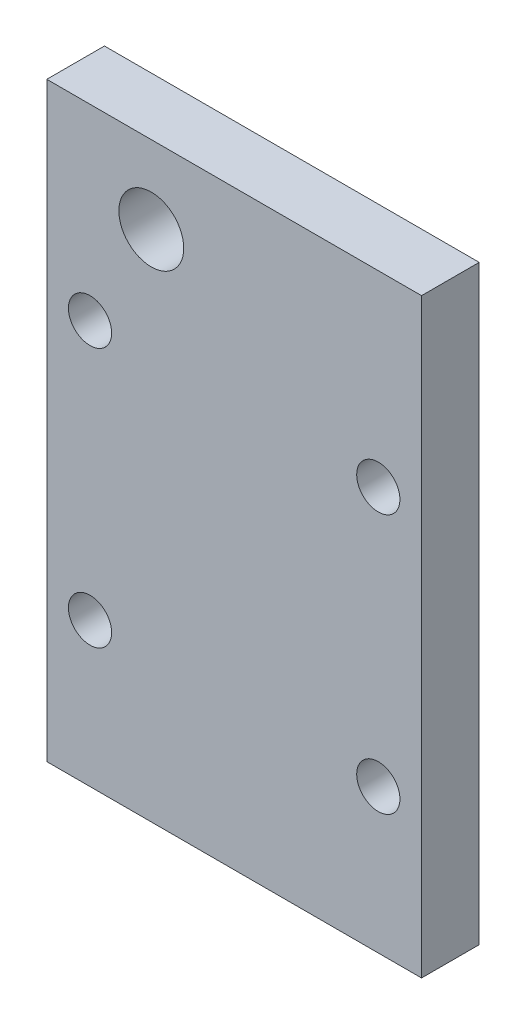
ISO-10303-21;
HEADER;
FILE_DESCRIPTION(('STEP AP214'),'2;1');
FILE_NAME('part.step','',(''),(''),'','','');
FILE_SCHEMA(('AUTOMOTIVE_DESIGN { 1 0 10303 214 1 1 1 1 }'));
ENDSEC;
DATA;
#1=APPLICATION_CONTEXT('core data for automotive mechanical design processes');
#2=APPLICATION_PROTOCOL_DEFINITION('international standard','automotive_design',2000,#1);
#3=PRODUCT_CONTEXT('',#1,'mechanical');
#4=PRODUCT('Part','Part','',(#3));
#5=PRODUCT_RELATED_PRODUCT_CATEGORY('part','',(#4));
#6=PRODUCT_DEFINITION_FORMATION('','',#4);
#7=PRODUCT_DEFINITION_CONTEXT('part definition',#1,'design');
#8=PRODUCT_DEFINITION('design','',#6,#7);
#9=PRODUCT_DEFINITION_SHAPE('','',#8);
#10=(LENGTH_UNIT() NAMED_UNIT(*) SI_UNIT(.MILLI.,.METRE.));
#11=(NAMED_UNIT(*) PLANE_ANGLE_UNIT() SI_UNIT($,.RADIAN.));
#12=(NAMED_UNIT(*) SI_UNIT($,.STERADIAN.) SOLID_ANGLE_UNIT());
#13=UNCERTAINTY_MEASURE_WITH_UNIT(LENGTH_MEASURE(1.E-05),#10,'distance_accuracy_value','');
#14=(GEOMETRIC_REPRESENTATION_CONTEXT(3) GLOBAL_UNCERTAINTY_ASSIGNED_CONTEXT((#13)) GLOBAL_UNIT_ASSIGNED_CONTEXT((#10,
#11,#12)) REPRESENTATION_CONTEXT('',''));
#15=CARTESIAN_POINT('',(0.,0.,0.));
#16=DIRECTION('',(0.,0.,1.));
#17=DIRECTION('',(1.,0.,0.));
#18=AXIS2_PLACEMENT_3D('',#15,#16,#17);
#19=CARTESIAN_POINT('',(0.,0.,4.));
#20=DIRECTION('',(0.,0.,-1.));
#21=DIRECTION('',(-1.,0.,0.));
#22=AXIS2_PLACEMENT_3D('',#19,#20,#21);
#23=PLANE('',#22);
#24=DIRECTION('',(1.,0.,0.));
#25=VECTOR('',#24,1.);
#26=CARTESIAN_POINT('',(26.,0.,4.));
#27=LINE('',#26,#25);
#28=CARTESIAN_POINT('',(0.,0.,4.));
#29=VERTEX_POINT('',#28);
#30=CARTESIAN_POINT('',(26.,0.,4.));
#31=VERTEX_POINT('',#30);
#32=EDGE_CURVE('E89',#29,#31,#27,.T.);
#33=ORIENTED_EDGE('',*,*,#32,.T.);
#34=DIRECTION('',(0.,1.,0.));
#35=VECTOR('',#34,1.);
#36=CARTESIAN_POINT('',(26.,41.,4.));
#37=LINE('',#36,#35);
#38=CARTESIAN_POINT('',(26.,41.,4.));
#39=VERTEX_POINT('',#38);
#40=EDGE_CURVE('E84',#31,#39,#37,.T.);
#41=ORIENTED_EDGE('',*,*,#40,.T.);
#42=DIRECTION('',(-1.,0.,0.));
#43=VECTOR('',#42,1.);
#44=CARTESIAN_POINT('',(0.,41.,4.));
#45=LINE('',#44,#43);
#46=CARTESIAN_POINT('',(0.,41.,4.));
#47=VERTEX_POINT('',#46);
#48=EDGE_CURVE('E87',#39,#47,#45,.T.);
#49=ORIENTED_EDGE('',*,*,#48,.T.);
#50=DIRECTION('',(0.,-1.,0.));
#51=VECTOR('',#50,1.);
#52=CARTESIAN_POINT('',(0.,0.,4.));
#53=LINE('',#52,#51);
#54=EDGE_CURVE('E54',#47,#29,#53,.T.);
#55=ORIENTED_EDGE('',*,*,#54,.T.);
#56=EDGE_LOOP('',(#33,#41,#49,#55));
#57=FACE_BOUND('',#56,.T.);
#58=CARTESIAN_POINT('',(7.24999999999999,35.6,4.));
#59=DIRECTION('',(0.,0.,1.));
#60=DIRECTION('',(1.,0.,0.));
#61=AXIS2_PLACEMENT_3D('',#58,#59,#60);
#62=CIRCLE('',#61,2.25);
#63=CARTESIAN_POINT('',(9.49999999999999,35.6,4.));
#64=VERTEX_POINT('',#63);
#65=EDGE_CURVE('E104',#64,#64,#62,.T.);
#66=ORIENTED_EDGE('',*,*,#65,.F.);
#67=EDGE_LOOP('',(#66));
#68=FACE_BOUND('',#67,.T.);
#69=CARTESIAN_POINT('',(3.00000000000001,28.,4.));
#70=DIRECTION('',(0.,0.,1.));
#71=DIRECTION('',(1.,0.,0.));
#72=AXIS2_PLACEMENT_3D('',#69,#70,#71);
#73=CIRCLE('',#72,1.5);
#74=CARTESIAN_POINT('',(4.50000000000001,28.,4.));
#75=VERTEX_POINT('',#74);
#76=EDGE_CURVE('E119',#75,#75,#73,.T.);
#77=ORIENTED_EDGE('',*,*,#76,.F.);
#78=EDGE_LOOP('',(#77));
#79=FACE_BOUND('',#78,.T.);
#80=CARTESIAN_POINT('',(3.00000000000001,10.,4.));
#81=DIRECTION('',(0.,0.,1.));
#82=DIRECTION('',(1.,0.,0.));
#83=AXIS2_PLACEMENT_3D('',#80,#81,#82);
#84=CIRCLE('',#83,1.5);
#85=CARTESIAN_POINT('',(4.50000000000001,10.,4.));
#86=VERTEX_POINT('',#85);
#87=EDGE_CURVE('E125',#86,#86,#84,.T.);
#88=ORIENTED_EDGE('',*,*,#87,.F.);
#89=EDGE_LOOP('',(#88));
#90=FACE_BOUND('',#89,.T.);
#91=CARTESIAN_POINT('',(23.,10.,4.));
#92=DIRECTION('',(0.,0.,1.));
#93=DIRECTION('',(-1.,0.,0.));
#94=AXIS2_PLACEMENT_3D('',#91,#92,#93);
#95=CIRCLE('',#94,1.5);
#96=CARTESIAN_POINT('',(21.5,10.,4.));
#97=VERTEX_POINT('',#96);
#98=EDGE_CURVE('E131',#97,#97,#95,.T.);
#99=ORIENTED_EDGE('',*,*,#98,.F.);
#100=EDGE_LOOP('',(#99));
#101=FACE_BOUND('',#100,.T.);
#102=CARTESIAN_POINT('',(23.,28.,4.));
#103=DIRECTION('',(0.,0.,1.));
#104=DIRECTION('',(-1.,0.,0.));
#105=AXIS2_PLACEMENT_3D('',#102,#103,#104);
#106=CIRCLE('',#105,1.5);
#107=CARTESIAN_POINT('',(21.5,28.,4.));
#108=VERTEX_POINT('',#107);
#109=EDGE_CURVE('E137',#108,#108,#106,.T.);
#110=ORIENTED_EDGE('',*,*,#109,.F.);
#111=EDGE_LOOP('',(#110));
#112=FACE_BOUND('',#111,.T.);
#113=ADVANCED_FACE('F37',(#57,#68,#79,#90,#101,#112),#23,.F.);
#114=CARTESIAN_POINT('',(0.,0.,0.));
#115=DIRECTION('',(0.,0.,-1.));
#116=DIRECTION('',(-1.,0.,0.));
#117=AXIS2_PLACEMENT_3D('',#114,#115,#116);
#118=PLANE('',#117);
#119=CARTESIAN_POINT('',(23.,10.,0.));
#120=DIRECTION('',(0.,0.,1.));
#121=DIRECTION('',(-1.,0.,0.));
#122=AXIS2_PLACEMENT_3D('',#119,#120,#121);
#123=CIRCLE('',#122,1.5);
#124=CARTESIAN_POINT('',(21.5,10.,0.));
#125=VERTEX_POINT('',#124);
#126=EDGE_CURVE('E134',#125,#125,#123,.T.);
#127=ORIENTED_EDGE('',*,*,#126,.T.);
#128=EDGE_LOOP('',(#127));
#129=FACE_BOUND('',#128,.T.);
#130=CARTESIAN_POINT('',(3.00000000000001,28.,0.));
#131=DIRECTION('',(0.,0.,1.));
#132=DIRECTION('',(1.,0.,0.));
#133=AXIS2_PLACEMENT_3D('',#130,#131,#132);
#134=CIRCLE('',#133,1.5);
#135=CARTESIAN_POINT('',(4.50000000000001,28.,0.));
#136=VERTEX_POINT('',#135);
#137=EDGE_CURVE('E122',#136,#136,#134,.T.);
#138=ORIENTED_EDGE('',*,*,#137,.T.);
#139=EDGE_LOOP('',(#138));
#140=FACE_BOUND('',#139,.T.);
#141=DIRECTION('',(1.,0.,0.));
#142=VECTOR('',#141,1.);
#143=CARTESIAN_POINT('',(26.,0.,0.));
#144=LINE('',#143,#142);
#145=CARTESIAN_POINT('',(0.,0.,0.));
#146=VERTEX_POINT('',#145);
#147=CARTESIAN_POINT('',(26.,0.,0.));
#148=VERTEX_POINT('',#147);
#149=EDGE_CURVE('E101',#146,#148,#144,.T.);
#150=ORIENTED_EDGE('',*,*,#149,.F.);
#151=DIRECTION('',(0.,-1.,0.));
#152=VECTOR('',#151,1.);
#153=CARTESIAN_POINT('',(0.,0.,0.));
#154=LINE('',#153,#152);
#155=CARTESIAN_POINT('',(0.,41.,0.));
#156=VERTEX_POINT('',#155);
#157=EDGE_CURVE('E77',#156,#146,#154,.T.);
#158=ORIENTED_EDGE('',*,*,#157,.F.);
#159=DIRECTION('',(-1.,0.,0.));
#160=VECTOR('',#159,1.);
#161=CARTESIAN_POINT('',(0.,41.,0.));
#162=LINE('',#161,#160);
#163=CARTESIAN_POINT('',(26.,41.,0.));
#164=VERTEX_POINT('',#163);
#165=EDGE_CURVE('E71',#164,#156,#162,.T.);
#166=ORIENTED_EDGE('',*,*,#165,.F.);
#167=DIRECTION('',(0.,1.,0.));
#168=VECTOR('',#167,1.);
#169=CARTESIAN_POINT('',(26.,41.,0.));
#170=LINE('',#169,#168);
#171=EDGE_CURVE('E93',#148,#164,#170,.T.);
#172=ORIENTED_EDGE('',*,*,#171,.F.);
#173=EDGE_LOOP('',(#150,#158,#166,#172));
#174=FACE_BOUND('',#173,.T.);
#175=CARTESIAN_POINT('',(7.24999999999999,35.6,0.));
#176=DIRECTION('',(0.,0.,1.));
#177=DIRECTION('',(1.,0.,0.));
#178=AXIS2_PLACEMENT_3D('',#175,#176,#177);
#179=CIRCLE('',#178,2.25);
#180=CARTESIAN_POINT('',(9.49999999999999,35.6,0.));
#181=VERTEX_POINT('',#180);
#182=EDGE_CURVE('E116',#181,#181,#179,.T.);
#183=ORIENTED_EDGE('',*,*,#182,.T.);
#184=EDGE_LOOP('',(#183));
#185=FACE_BOUND('',#184,.T.);
#186=CARTESIAN_POINT('',(3.00000000000001,10.,0.));
#187=DIRECTION('',(0.,0.,1.));
#188=DIRECTION('',(1.,0.,0.));
#189=AXIS2_PLACEMENT_3D('',#186,#187,#188);
#190=CIRCLE('',#189,1.5);
#191=CARTESIAN_POINT('',(4.50000000000001,10.,0.));
#192=VERTEX_POINT('',#191);
#193=EDGE_CURVE('E128',#192,#192,#190,.T.);
#194=ORIENTED_EDGE('',*,*,#193,.T.);
#195=EDGE_LOOP('',(#194));
#196=FACE_BOUND('',#195,.T.);
#197=CARTESIAN_POINT('',(23.,28.,0.));
#198=DIRECTION('',(0.,0.,1.));
#199=DIRECTION('',(-1.,0.,0.));
#200=AXIS2_PLACEMENT_3D('',#197,#198,#199);
#201=CIRCLE('',#200,1.5);
#202=CARTESIAN_POINT('',(21.5,28.,0.));
#203=VERTEX_POINT('',#202);
#204=EDGE_CURVE('E140',#203,#203,#201,.T.);
#205=ORIENTED_EDGE('',*,*,#204,.T.);
#206=EDGE_LOOP('',(#205));
#207=FACE_BOUND('',#206,.T.);
#208=ADVANCED_FACE('F112',(#129,#140,#174,#185,#196,#207),#118,.T.);
#209=CARTESIAN_POINT('',(26.,0.,4.));
#210=DIRECTION('',(0.,1.,0.));
#211=DIRECTION('',(-1.,0.,0.));
#212=AXIS2_PLACEMENT_3D('',#209,#210,#211);
#213=PLANE('',#212);
#214=ORIENTED_EDGE('',*,*,#149,.T.);
#215=DIRECTION('',(0.,0.,-1.));
#216=VECTOR('',#215,1.);
#217=CARTESIAN_POINT('',(26.,0.,4.));
#218=LINE('',#217,#216);
#219=EDGE_CURVE('E11',#31,#148,#218,.T.);
#220=ORIENTED_EDGE('',*,*,#219,.F.);
#221=ORIENTED_EDGE('',*,*,#32,.F.);
#222=DIRECTION('',(0.,0.,-1.));
#223=VECTOR('',#222,1.);
#224=CARTESIAN_POINT('',(0.,0.,4.));
#225=LINE('',#224,#223);
#226=EDGE_CURVE('E97',#29,#146,#225,.T.);
#227=ORIENTED_EDGE('',*,*,#226,.T.);
#228=EDGE_LOOP('',(#214,#220,#221,#227));
#229=FACE_BOUND('',#228,.T.);
#230=ADVANCED_FACE('F39',(#229),#213,.F.);
#231=CARTESIAN_POINT('',(26.,41.,4.));
#232=DIRECTION('',(-1.,0.,0.));
#233=DIRECTION('',(0.,-1.,0.));
#234=AXIS2_PLACEMENT_3D('',#231,#232,#233);
#235=PLANE('',#234);
#236=ORIENTED_EDGE('',*,*,#171,.T.);
#237=DIRECTION('',(0.,0.,-1.));
#238=VECTOR('',#237,1.);
#239=CARTESIAN_POINT('',(26.,41.,4.));
#240=LINE('',#239,#238);
#241=EDGE_CURVE('E46',#39,#164,#240,.T.);
#242=ORIENTED_EDGE('',*,*,#241,.F.);
#243=ORIENTED_EDGE('',*,*,#40,.F.);
#244=ORIENTED_EDGE('',*,*,#219,.T.);
#245=EDGE_LOOP('',(#236,#242,#243,#244));
#246=FACE_BOUND('',#245,.T.);
#247=ADVANCED_FACE('F92',(#246),#235,.F.);
#248=CARTESIAN_POINT('',(0.,41.,4.));
#249=DIRECTION('',(0.,-1.,0.));
#250=DIRECTION('',(0.,0.,-1.));
#251=AXIS2_PLACEMENT_3D('',#248,#249,#250);
#252=PLANE('',#251);
#253=ORIENTED_EDGE('',*,*,#165,.T.);
#254=DIRECTION('',(0.,0.,-1.));
#255=VECTOR('',#254,1.);
#256=CARTESIAN_POINT('',(0.,41.,4.));
#257=LINE('',#256,#255);
#258=EDGE_CURVE('E94',#47,#156,#257,.T.);
#259=ORIENTED_EDGE('',*,*,#258,.F.);
#260=ORIENTED_EDGE('',*,*,#48,.F.);
#261=ORIENTED_EDGE('',*,*,#241,.T.);
#262=EDGE_LOOP('',(#253,#259,#260,#261));
#263=FACE_BOUND('',#262,.T.);
#264=ADVANCED_FACE('F95',(#263),#252,.F.);
#265=CARTESIAN_POINT('',(0.,0.,4.));
#266=DIRECTION('',(1.,0.,0.));
#267=DIRECTION('',(0.,0.,-1.));
#268=AXIS2_PLACEMENT_3D('',#265,#266,#267);
#269=PLANE('',#268);
#270=ORIENTED_EDGE('',*,*,#157,.T.);
#271=ORIENTED_EDGE('',*,*,#226,.F.);
#272=ORIENTED_EDGE('',*,*,#54,.F.);
#273=ORIENTED_EDGE('',*,*,#258,.T.);
#274=EDGE_LOOP('',(#270,#271,#272,#273));
#275=FACE_BOUND('',#274,.T.);
#276=ADVANCED_FACE('F109',(#275),#269,.F.);
#277=CARTESIAN_POINT('',(7.24999999999999,35.6,4.));
#278=DIRECTION('',(0.,0.,-1.));
#279=DIRECTION('',(-1.,0.,0.));
#280=AXIS2_PLACEMENT_3D('',#277,#278,#279);
#281=CYLINDRICAL_SURFACE('',#280,2.25);
#282=ORIENTED_EDGE('',*,*,#65,.T.);
#283=EDGE_LOOP('',(#282));
#284=FACE_BOUND('',#283,.T.);
#285=ORIENTED_EDGE('',*,*,#182,.F.);
#286=EDGE_LOOP('',(#285));
#287=FACE_BOUND('',#286,.T.);
#288=ADVANCED_FACE('F157',(#284,#287),#281,.F.);
#289=CARTESIAN_POINT('',(3.00000000000001,28.,4.));
#290=DIRECTION('',(0.,0.,-1.));
#291=DIRECTION('',(-1.,0.,0.));
#292=AXIS2_PLACEMENT_3D('',#289,#290,#291);
#293=CYLINDRICAL_SURFACE('',#292,1.5);
#294=ORIENTED_EDGE('',*,*,#76,.T.);
#295=EDGE_LOOP('',(#294));
#296=FACE_BOUND('',#295,.T.);
#297=ORIENTED_EDGE('',*,*,#137,.F.);
#298=EDGE_LOOP('',(#297));
#299=FACE_BOUND('',#298,.T.);
#300=ADVANCED_FACE('F203',(#296,#299),#293,.F.);
#301=CARTESIAN_POINT('',(3.00000000000001,10.,4.));
#302=DIRECTION('',(0.,0.,-1.));
#303=DIRECTION('',(-1.,0.,0.));
#304=AXIS2_PLACEMENT_3D('',#301,#302,#303);
#305=CYLINDRICAL_SURFACE('',#304,1.5);
#306=ORIENTED_EDGE('',*,*,#87,.T.);
#307=EDGE_LOOP('',(#306));
#308=FACE_BOUND('',#307,.T.);
#309=ORIENTED_EDGE('',*,*,#193,.F.);
#310=EDGE_LOOP('',(#309));
#311=FACE_BOUND('',#310,.T.);
#312=ADVANCED_FACE('F211',(#308,#311),#305,.F.);
#313=CARTESIAN_POINT('',(23.,10.,4.));
#314=DIRECTION('',(0.,0.,-1.));
#315=DIRECTION('',(-1.,0.,0.));
#316=AXIS2_PLACEMENT_3D('',#313,#314,#315);
#317=CYLINDRICAL_SURFACE('',#316,1.5);
#318=ORIENTED_EDGE('',*,*,#98,.T.);
#319=EDGE_LOOP('',(#318));
#320=FACE_BOUND('',#319,.T.);
#321=ORIENTED_EDGE('',*,*,#126,.F.);
#322=EDGE_LOOP('',(#321));
#323=FACE_BOUND('',#322,.T.);
#324=ADVANCED_FACE('F219',(#320,#323),#317,.F.);
#325=CARTESIAN_POINT('',(23.,28.,4.));
#326=DIRECTION('',(0.,0.,-1.));
#327=DIRECTION('',(-1.,0.,0.));
#328=AXIS2_PLACEMENT_3D('',#325,#326,#327);
#329=CYLINDRICAL_SURFACE('',#328,1.5);
#330=ORIENTED_EDGE('',*,*,#109,.T.);
#331=EDGE_LOOP('',(#330));
#332=FACE_BOUND('',#331,.T.);
#333=ORIENTED_EDGE('',*,*,#204,.F.);
#334=EDGE_LOOP('',(#333));
#335=FACE_BOUND('',#334,.T.);
#336=ADVANCED_FACE('F146',(#332,#335),#329,.F.);
#337=CLOSED_SHELL('',(#113,#208,#230,#247,#264,#276,#288,#300,#312,#324,#336));
#338=MANIFOLD_SOLID_BREP('B2',#337);
#339=ADVANCED_BREP_SHAPE_REPRESENTATION('',(#18,#338),#14);
#340=SHAPE_DEFINITION_REPRESENTATION(#9,#339);
ENDSEC;
END-ISO-10303-21;
